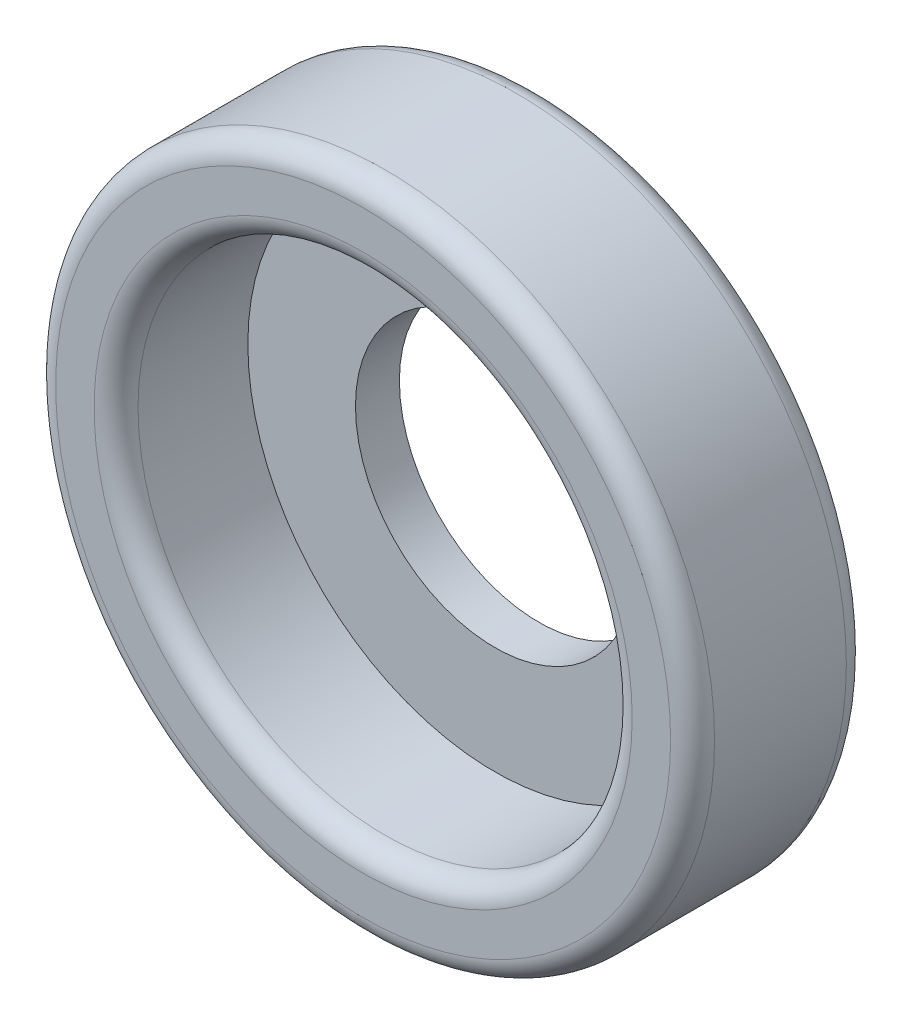
ISO-10303-21;
HEADER;
FILE_DESCRIPTION(('STEP AP214'),'2;1');
FILE_NAME('part.step','',(''),(''),'','','');
FILE_SCHEMA(('AUTOMOTIVE_DESIGN { 1 0 10303 214 1 1 1 1 }'));
ENDSEC;
DATA;
#1=APPLICATION_CONTEXT('core data for automotive mechanical design processes');
#2=APPLICATION_PROTOCOL_DEFINITION('international standard','automotive_design',2000,#1);
#3=PRODUCT_CONTEXT('',#1,'mechanical');
#4=PRODUCT('Part','Part','',(#3));
#5=PRODUCT_RELATED_PRODUCT_CATEGORY('part','',(#4));
#6=PRODUCT_DEFINITION_FORMATION('','',#4);
#7=PRODUCT_DEFINITION_CONTEXT('part definition',#1,'design');
#8=PRODUCT_DEFINITION('design','',#6,#7);
#9=PRODUCT_DEFINITION_SHAPE('','',#8);
#10=(LENGTH_UNIT() NAMED_UNIT(*) SI_UNIT(.MILLI.,.METRE.));
#11=(NAMED_UNIT(*) PLANE_ANGLE_UNIT() SI_UNIT($,.RADIAN.));
#12=(NAMED_UNIT(*) SI_UNIT($,.STERADIAN.) SOLID_ANGLE_UNIT());
#13=UNCERTAINTY_MEASURE_WITH_UNIT(LENGTH_MEASURE(1.E-05),#10,'distance_accuracy_value','');
#14=(GEOMETRIC_REPRESENTATION_CONTEXT(3) GLOBAL_UNCERTAINTY_ASSIGNED_CONTEXT((#13)) GLOBAL_UNIT_ASSIGNED_CONTEXT((#10,
#11,#12)) REPRESENTATION_CONTEXT('',''));
#15=CARTESIAN_POINT('',(0.,0.,0.));
#16=DIRECTION('',(0.,0.,1.));
#17=DIRECTION('',(1.,0.,0.));
#18=AXIS2_PLACEMENT_3D('',#15,#16,#17);
#19=CARTESIAN_POINT('',(0.,0.,8.));
#20=DIRECTION('',(0.,0.,-1.));
#21=DIRECTION('',(-1.,0.,0.));
#22=AXIS2_PLACEMENT_3D('',#19,#20,#21);
#23=CYLINDRICAL_SURFACE('',#22,11.25);
#24=CARTESIAN_POINT('',(0.,0.,7.));
#25=DIRECTION('',(0.,0.,1.));
#26=DIRECTION('',(1.,0.,0.));
#27=AXIS2_PLACEMENT_3D('',#24,#25,#26);
#28=CIRCLE('',#27,11.25);
#29=CARTESIAN_POINT('',(11.25,0.,7.));
#30=VERTEX_POINT('',#29);
#31=EDGE_CURVE('E54',#30,#30,#28,.T.);
#32=ORIENTED_EDGE('',*,*,#31,.T.);
#33=EDGE_LOOP('',(#32));
#34=FACE_BOUND('',#33,.T.);
#35=CARTESIAN_POINT('',(0.,0.,2.));
#36=DIRECTION('',(0.,0.,1.));
#37=DIRECTION('',(1.,0.,0.));
#38=AXIS2_PLACEMENT_3D('',#35,#36,#37);
#39=CIRCLE('',#38,11.25);
#40=CARTESIAN_POINT('',(11.25,0.,2.));
#41=VERTEX_POINT('',#40);
#42=EDGE_CURVE('E57',#41,#41,#39,.T.);
#43=ORIENTED_EDGE('',*,*,#42,.F.);
#44=EDGE_LOOP('',(#43));
#45=FACE_BOUND('',#44,.T.);
#46=ADVANCED_FACE('F31',(#34,#45),#23,.F.);
#47=CARTESIAN_POINT('',(0.,0.,8.));
#48=DIRECTION('',(0.,0.,-1.));
#49=DIRECTION('',(-1.,0.,0.));
#50=AXIS2_PLACEMENT_3D('',#47,#48,#49);
#51=CYLINDRICAL_SURFACE('',#50,15.);
#52=CARTESIAN_POINT('',(0.,0.,7.));
#53=DIRECTION('',(0.,0.,1.));
#54=DIRECTION('',(1.,0.,0.));
#55=AXIS2_PLACEMENT_3D('',#52,#53,#54);
#56=CIRCLE('',#55,15.);
#57=CARTESIAN_POINT('',(15.,0.,7.));
#58=VERTEX_POINT('',#57);
#59=EDGE_CURVE('E38',#58,#58,#56,.F.);
#60=ORIENTED_EDGE('',*,*,#59,.T.);
#61=EDGE_LOOP('',(#60));
#62=FACE_BOUND('',#61,.T.);
#63=CARTESIAN_POINT('',(0.,0.,1.));
#64=DIRECTION('',(0.,0.,1.));
#65=DIRECTION('',(1.,0.,0.));
#66=AXIS2_PLACEMENT_3D('',#63,#64,#65);
#67=CIRCLE('',#66,15.);
#68=CARTESIAN_POINT('',(15.,0.,1.));
#69=VERTEX_POINT('',#68);
#70=EDGE_CURVE('E42',#69,#69,#67,.T.);
#71=ORIENTED_EDGE('',*,*,#70,.T.);
#72=EDGE_LOOP('',(#71));
#73=FACE_BOUND('',#72,.T.);
#74=ADVANCED_FACE('F78',(#62,#73),#51,.T.);
#75=CARTESIAN_POINT('',(0.,0.,8.));
#76=DIRECTION('',(0.,0.,1.));
#77=DIRECTION('',(1.,0.,0.));
#78=AXIS2_PLACEMENT_3D('',#75,#76,#77);
#79=PLANE('',#78);
#80=CARTESIAN_POINT('',(0.,0.,8.));
#81=DIRECTION('',(0.,0.,1.));
#82=DIRECTION('',(1.,0.,0.));
#83=AXIS2_PLACEMENT_3D('',#80,#81,#82);
#84=CIRCLE('',#83,12.25);
#85=CARTESIAN_POINT('',(12.25,0.,8.));
#86=VERTEX_POINT('',#85);
#87=EDGE_CURVE('E46',#86,#86,#84,.F.);
#88=ORIENTED_EDGE('',*,*,#87,.T.);
#89=EDGE_LOOP('',(#88));
#90=FACE_BOUND('',#89,.T.);
#91=CARTESIAN_POINT('',(0.,0.,8.));
#92=DIRECTION('',(0.,0.,1.));
#93=DIRECTION('',(1.,0.,0.));
#94=AXIS2_PLACEMENT_3D('',#91,#92,#93);
#95=CIRCLE('',#94,14.);
#96=CARTESIAN_POINT('',(14.,0.,8.));
#97=VERTEX_POINT('',#96);
#98=EDGE_CURVE('E51',#97,#97,#95,.T.);
#99=ORIENTED_EDGE('',*,*,#98,.T.);
#100=EDGE_LOOP('',(#99));
#101=FACE_BOUND('',#100,.T.);
#102=ADVANCED_FACE('F85',(#90,#101),#79,.T.);
#103=CARTESIAN_POINT('',(0.,0.,0.));
#104=DIRECTION('',(0.,0.,1.));
#105=DIRECTION('',(1.,0.,0.));
#106=AXIS2_PLACEMENT_3D('',#103,#104,#105);
#107=PLANE('',#106);
#108=CARTESIAN_POINT('',(0.,0.,0.));
#109=DIRECTION('',(0.,0.,1.));
#110=DIRECTION('',(1.,0.,0.));
#111=AXIS2_PLACEMENT_3D('',#108,#109,#110);
#112=CIRCLE('',#111,14.);
#113=CARTESIAN_POINT('',(14.,0.,0.));
#114=VERTEX_POINT('',#113);
#115=EDGE_CURVE('E10',#114,#114,#112,.F.);
#116=ORIENTED_EDGE('',*,*,#115,.T.);
#117=EDGE_LOOP('',(#116));
#118=FACE_BOUND('',#117,.T.);
#119=CARTESIAN_POINT('',(0.,0.,0.));
#120=DIRECTION('',(0.,0.,1.));
#121=DIRECTION('',(1.,0.,0.));
#122=AXIS2_PLACEMENT_3D('',#119,#120,#121);
#123=CIRCLE('',#122,6.35);
#124=CARTESIAN_POINT('',(6.35,0.,0.));
#125=VERTEX_POINT('',#124);
#126=EDGE_CURVE('E61',#125,#125,#123,.T.);
#127=ORIENTED_EDGE('',*,*,#126,.T.);
#128=EDGE_LOOP('',(#127));
#129=FACE_BOUND('',#128,.T.);
#130=ADVANCED_FACE('F102',(#118,#129),#107,.F.);
#131=CARTESIAN_POINT('',(0.,0.,2.));
#132=DIRECTION('',(0.,0.,-1.));
#133=DIRECTION('',(-1.,0.,0.));
#134=AXIS2_PLACEMENT_3D('',#131,#132,#133);
#135=CYLINDRICAL_SURFACE('',#134,6.35);
#136=CARTESIAN_POINT('',(0.,0.,2.));
#137=DIRECTION('',(0.,0.,1.));
#138=DIRECTION('',(1.,0.,0.));
#139=AXIS2_PLACEMENT_3D('',#136,#137,#138);
#140=CIRCLE('',#139,6.35);
#141=CARTESIAN_POINT('',(6.35,0.,2.));
#142=VERTEX_POINT('',#141);
#143=EDGE_CURVE('E60',#142,#142,#140,.T.);
#144=ORIENTED_EDGE('',*,*,#143,.T.);
#145=EDGE_LOOP('',(#144));
#146=FACE_BOUND('',#145,.T.);
#147=ORIENTED_EDGE('',*,*,#126,.F.);
#148=EDGE_LOOP('',(#147));
#149=FACE_BOUND('',#148,.T.);
#150=ADVANCED_FACE('F67',(#146,#149),#135,.F.);
#151=CARTESIAN_POINT('',(0.,0.,2.));
#152=DIRECTION('',(0.,0.,1.));
#153=DIRECTION('',(1.,0.,0.));
#154=AXIS2_PLACEMENT_3D('',#151,#152,#153);
#155=PLANE('',#154);
#156=ORIENTED_EDGE('',*,*,#143,.F.);
#157=EDGE_LOOP('',(#156));
#158=FACE_BOUND('',#157,.T.);
#159=ORIENTED_EDGE('',*,*,#42,.T.);
#160=EDGE_LOOP('',(#159));
#161=FACE_BOUND('',#160,.T.);
#162=ADVANCED_FACE('F70',(#158,#161),#155,.T.);
#163=CARTESIAN_POINT('',(0.,0.,7.));
#164=DIRECTION('',(0.,0.,1.));
#165=DIRECTION('',(1.,0.,0.));
#166=AXIS2_PLACEMENT_3D('',#163,#164,#165);
#167=TOROIDAL_SURFACE('',#166,12.25,1.);
#168=ORIENTED_EDGE('',*,*,#87,.F.);
#169=EDGE_LOOP('',(#168));
#170=FACE_BOUND('',#169,.T.);
#171=ORIENTED_EDGE('',*,*,#31,.F.);
#172=EDGE_LOOP('',(#171));
#173=FACE_BOUND('',#172,.T.);
#174=ADVANCED_FACE('F73',(#170,#173),#167,.T.);
#175=CARTESIAN_POINT('',(0.,0.,7.));
#176=DIRECTION('',(0.,0.,1.));
#177=DIRECTION('',(1.,0.,0.));
#178=AXIS2_PLACEMENT_3D('',#175,#176,#177);
#179=TOROIDAL_SURFACE('',#178,14.,1.);
#180=ORIENTED_EDGE('',*,*,#59,.F.);
#181=EDGE_LOOP('',(#180));
#182=FACE_BOUND('',#181,.T.);
#183=ORIENTED_EDGE('',*,*,#98,.F.);
#184=EDGE_LOOP('',(#183));
#185=FACE_BOUND('',#184,.T.);
#186=ADVANCED_FACE('F90',(#182,#185),#179,.T.);
#187=CARTESIAN_POINT('',(0.,0.,1.));
#188=DIRECTION('',(0.,0.,1.));
#189=DIRECTION('',(1.,0.,0.));
#190=AXIS2_PLACEMENT_3D('',#187,#188,#189);
#191=TOROIDAL_SURFACE('',#190,14.,1.);
#192=ORIENTED_EDGE('',*,*,#115,.F.);
#193=EDGE_LOOP('',(#192));
#194=FACE_BOUND('',#193,.T.);
#195=ORIENTED_EDGE('',*,*,#70,.F.);
#196=EDGE_LOOP('',(#195));
#197=FACE_BOUND('',#196,.T.);
#198=ADVANCED_FACE('F33',(#194,#197),#191,.T.);
#199=CLOSED_SHELL('',(#46,#74,#102,#130,#150,#162,#174,#186,#198));
#200=MANIFOLD_SOLID_BREP('B2',#199);
#201=ADVANCED_BREP_SHAPE_REPRESENTATION('',(#18,#200),#14);
#202=SHAPE_DEFINITION_REPRESENTATION(#9,#201);
ENDSEC;
END-ISO-10303-21;
